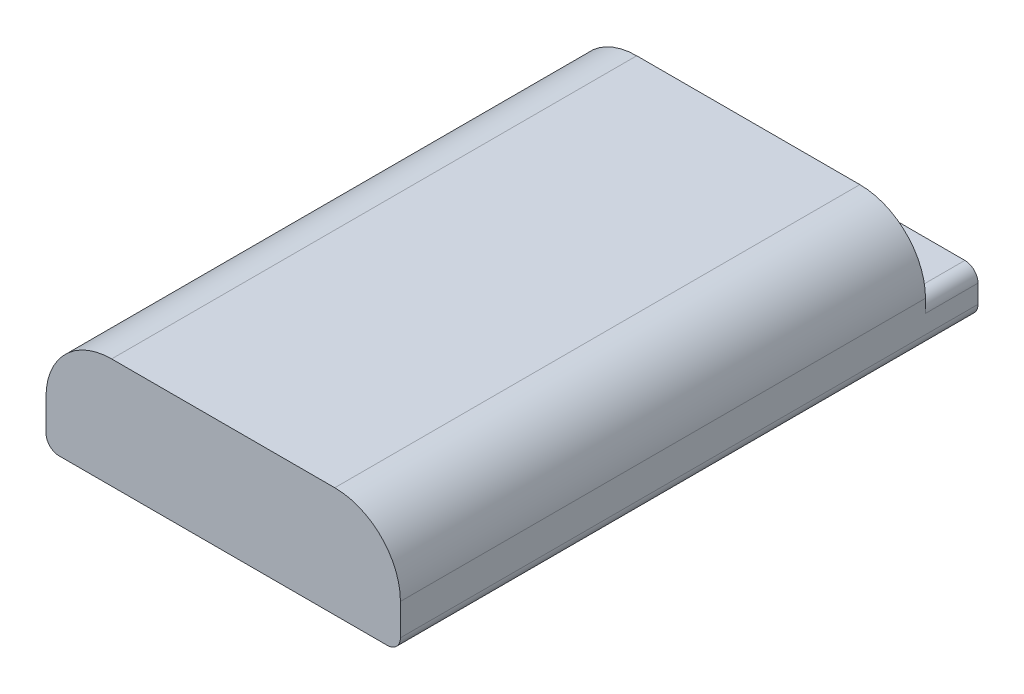
ISO-10303-21;
HEADER;
FILE_DESCRIPTION(('STEP AP214'),'2;1');
FILE_NAME('part.step','',(''),(''),'','','');
FILE_SCHEMA(('AUTOMOTIVE_DESIGN { 1 0 10303 214 1 1 1 1 }'));
ENDSEC;
DATA;
#1=APPLICATION_CONTEXT('core data for automotive mechanical design processes');
#2=APPLICATION_PROTOCOL_DEFINITION('international standard','automotive_design',2000,#1);
#3=PRODUCT_CONTEXT('',#1,'mechanical');
#4=PRODUCT('Part','Part','',(#3));
#5=PRODUCT_RELATED_PRODUCT_CATEGORY('part','',(#4));
#6=PRODUCT_DEFINITION_FORMATION('','',#4);
#7=PRODUCT_DEFINITION_CONTEXT('part definition',#1,'design');
#8=PRODUCT_DEFINITION('design','',#6,#7);
#9=PRODUCT_DEFINITION_SHAPE('','',#8);
#10=(LENGTH_UNIT() NAMED_UNIT(*) SI_UNIT(.MILLI.,.METRE.));
#11=(NAMED_UNIT(*) PLANE_ANGLE_UNIT() SI_UNIT($,.RADIAN.));
#12=(NAMED_UNIT(*) SI_UNIT($,.STERADIAN.) SOLID_ANGLE_UNIT());
#13=UNCERTAINTY_MEASURE_WITH_UNIT(LENGTH_MEASURE(1.E-05),#10,'distance_accuracy_value','');
#14=(GEOMETRIC_REPRESENTATION_CONTEXT(3) GLOBAL_UNCERTAINTY_ASSIGNED_CONTEXT((#13)) GLOBAL_UNIT_ASSIGNED_CONTEXT((#10,
#11,#12)) REPRESENTATION_CONTEXT('',''));
#15=CARTESIAN_POINT('',(0.,0.,0.));
#16=DIRECTION('',(0.,0.,1.));
#17=DIRECTION('',(1.,0.,0.));
#18=AXIS2_PLACEMENT_3D('',#15,#16,#17);
#19=CARTESIAN_POINT('',(-17.145,4.318,-27.94));
#20=DIRECTION('',(1.,0.,0.));
#21=DIRECTION('',(0.,0.,-1.));
#22=AXIS2_PLACEMENT_3D('',#19,#20,#21);
#23=PLANE('',#22);
#24=DIRECTION('',(0.,-1.,0.));
#25=VECTOR('',#24,1.);
#26=CARTESIAN_POINT('',(-17.145,4.318,27.94));
#27=LINE('',#26,#25);
#28=CARTESIAN_POINT('',(-17.145,4.31799999999996,27.94));
#29=VERTEX_POINT('',#28);
#30=CARTESIAN_POINT('',(-17.145,1.27000000000001,27.94));
#31=VERTEX_POINT('',#30);
#32=EDGE_CURVE('E165',#29,#31,#27,.T.);
#33=ORIENTED_EDGE('',*,*,#32,.F.);
#34=DIRECTION('',(0.,0.,-1.));
#35=VECTOR('',#34,1.);
#36=CARTESIAN_POINT('',(-17.145,4.31799999999996,27.94));
#37=LINE('',#36,#35);
#38=CARTESIAN_POINT('',(-17.145,4.31799999999996,-22.86));
#39=VERTEX_POINT('',#38);
#40=EDGE_CURVE('E483',#29,#39,#37,.T.);
#41=ORIENTED_EDGE('',*,*,#40,.T.);
#42=DIRECTION('',(0.,-1.,0.));
#43=VECTOR('',#42,1.);
#44=CARTESIAN_POINT('',(-17.145,10.668,-22.86));
#45=LINE('',#44,#43);
#46=CARTESIAN_POINT('',(-17.145,3.04799999999999,-22.86));
#47=VERTEX_POINT('',#46);
#48=EDGE_CURVE('E254',#39,#47,#45,.T.);
#49=ORIENTED_EDGE('',*,*,#48,.T.);
#50=DIRECTION('',(0.,0.,-1.));
#51=VECTOR('',#50,1.);
#52=CARTESIAN_POINT('',(-17.145,3.04799999999999,15.898577987311));
#53=LINE('',#52,#51);
#54=CARTESIAN_POINT('',(-17.145,3.04799999999999,-27.94));
#55=VERTEX_POINT('',#54);
#56=EDGE_CURVE('E195',#47,#55,#53,.T.);
#57=ORIENTED_EDGE('',*,*,#56,.T.);
#58=DIRECTION('',(0.,-1.,0.));
#59=VECTOR('',#58,1.);
#60=CARTESIAN_POINT('',(-17.145,4.318,-27.94));
#61=LINE('',#60,#59);
#62=CARTESIAN_POINT('',(-17.145,1.27000000000001,-27.94));
#63=VERTEX_POINT('',#62);
#64=EDGE_CURVE('E64',#55,#63,#61,.T.);
#65=ORIENTED_EDGE('',*,*,#64,.T.);
#66=DIRECTION('',(0.,0.,-1.));
#67=VECTOR('',#66,1.);
#68=CARTESIAN_POINT('',(-17.145,1.27000000000001,15.898577987311));
#69=LINE('',#68,#67);
#70=EDGE_CURVE('E157',#31,#63,#69,.T.);
#71=ORIENTED_EDGE('',*,*,#70,.F.);
#72=EDGE_LOOP('',(#33,#41,#49,#57,#65,#71));
#73=FACE_BOUND('',#72,.T.);
#74=ADVANCED_FACE('F55',(#73),#23,.F.);
#75=CARTESIAN_POINT('',(-17.145,4.318,27.94));
#76=DIRECTION('',(0.,0.,-1.));
#77=DIRECTION('',(-1.,0.,0.));
#78=AXIS2_PLACEMENT_3D('',#75,#76,#77);
#79=PLANE('',#78);
#80=CARTESIAN_POINT('',(-10.795,4.318,27.94));
#81=DIRECTION('',(0.,0.,-1.));
#82=DIRECTION('',(-1.,0.,0.));
#83=AXIS2_PLACEMENT_3D('',#80,#81,#82);
#84=CIRCLE('',#83,6.35);
#85=CARTESIAN_POINT('',(-10.795,10.668,27.94));
#86=VERTEX_POINT('',#85);
#87=EDGE_CURVE('E79',#29,#86,#84,.T.);
#88=ORIENTED_EDGE('',*,*,#87,.F.);
#89=ORIENTED_EDGE('',*,*,#32,.T.);
#90=CARTESIAN_POINT('',(-15.875,1.27,27.94));
#91=DIRECTION('',(0.,0.,-1.));
#92=DIRECTION('',(-1.,0.,0.));
#93=AXIS2_PLACEMENT_3D('',#90,#91,#92);
#94=CIRCLE('',#93,1.27);
#95=CARTESIAN_POINT('',(-15.875,0.,27.94));
#96=VERTEX_POINT('',#95);
#97=EDGE_CURVE('E148',#96,#31,#94,.T.);
#98=ORIENTED_EDGE('',*,*,#97,.F.);
#99=DIRECTION('',(1.,0.,0.));
#100=VECTOR('',#99,1.);
#101=CARTESIAN_POINT('',(-17.145,0.,27.94));
#102=LINE('',#101,#100);
#103=CARTESIAN_POINT('',(15.875,0.,27.94));
#104=VERTEX_POINT('',#103);
#105=EDGE_CURVE('E163',#96,#104,#102,.T.);
#106=ORIENTED_EDGE('',*,*,#105,.T.);
#107=CARTESIAN_POINT('',(15.875,1.27,27.94));
#108=DIRECTION('',(0.,0.,-1.));
#109=DIRECTION('',(-1.,0.,0.));
#110=AXIS2_PLACEMENT_3D('',#107,#108,#109);
#111=CIRCLE('',#110,1.27);
#112=CARTESIAN_POINT('',(17.145,1.27,27.94));
#113=VERTEX_POINT('',#112);
#114=EDGE_CURVE('E167',#113,#104,#111,.T.);
#115=ORIENTED_EDGE('',*,*,#114,.F.);
#116=DIRECTION('',(0.,-1.,0.));
#117=VECTOR('',#116,1.);
#118=CARTESIAN_POINT('',(17.145,4.318,27.94));
#119=LINE('',#118,#117);
#120=CARTESIAN_POINT('',(17.145,4.31799999999995,27.94));
#121=VERTEX_POINT('',#120);
#122=EDGE_CURVE('E180',#121,#113,#119,.T.);
#123=ORIENTED_EDGE('',*,*,#122,.F.);
#124=CARTESIAN_POINT('',(10.795,4.318,27.94));
#125=DIRECTION('',(0.,0.,-1.));
#126=DIRECTION('',(-1.,0.,0.));
#127=AXIS2_PLACEMENT_3D('',#124,#125,#126);
#128=CIRCLE('',#127,6.35);
#129=CARTESIAN_POINT('',(10.795,10.668,27.94));
#130=VERTEX_POINT('',#129);
#131=EDGE_CURVE('E497',#121,#130,#128,.F.);
#132=ORIENTED_EDGE('',*,*,#131,.T.);
#133=DIRECTION('',(1.,0.,0.));
#134=VECTOR('',#133,1.);
#135=CARTESIAN_POINT('',(-17.145,10.668,27.94));
#136=LINE('',#135,#134);
#137=EDGE_CURVE('E246',#86,#130,#136,.T.);
#138=ORIENTED_EDGE('',*,*,#137,.F.);
#139=EDGE_LOOP('',(#88,#89,#98,#106,#115,#123,#132,#138));
#140=FACE_BOUND('',#139,.T.);
#141=ADVANCED_FACE('F161',(#140),#79,.F.);
#142=CARTESIAN_POINT('',(0.,0.,0.));
#143=DIRECTION('',(0.,1.,0.));
#144=DIRECTION('',(0.,0.,1.));
#145=AXIS2_PLACEMENT_3D('',#142,#143,#144);
#146=PLANE('',#145);
#147=DIRECTION('',(0.,0.,-1.));
#148=VECTOR('',#147,1.);
#149=CARTESIAN_POINT('',(15.875,0.,15.898577987311));
#150=LINE('',#149,#148);
#151=CARTESIAN_POINT('',(15.875,0.,-27.94));
#152=VERTEX_POINT('',#151);
#153=EDGE_CURVE('E171',#104,#152,#150,.T.);
#154=ORIENTED_EDGE('',*,*,#153,.F.);
#155=ORIENTED_EDGE('',*,*,#105,.F.);
#156=DIRECTION('',(0.,0.,-1.));
#157=VECTOR('',#156,1.);
#158=CARTESIAN_POINT('',(-15.875,0.,15.898577987311));
#159=LINE('',#158,#157);
#160=CARTESIAN_POINT('',(-15.875,0.,-27.94));
#161=VERTEX_POINT('',#160);
#162=EDGE_CURVE('E145',#96,#161,#159,.T.);
#163=ORIENTED_EDGE('',*,*,#162,.T.);
#164=DIRECTION('',(-1.,0.,0.));
#165=VECTOR('',#164,1.);
#166=CARTESIAN_POINT('',(-17.145,0.,-27.94));
#167=LINE('',#166,#165);
#168=EDGE_CURVE('E175',#152,#161,#167,.T.);
#169=ORIENTED_EDGE('',*,*,#168,.F.);
#170=EDGE_LOOP('',(#154,#155,#163,#169));
#171=FACE_BOUND('',#170,.T.);
#172=ADVANCED_FACE('F170',(#171),#146,.F.);
#173=CARTESIAN_POINT('',(-17.145,10.668,-22.86));
#174=DIRECTION('',(0.,0.,1.));
#175=DIRECTION('',(1.,0.,0.));
#176=AXIS2_PLACEMENT_3D('',#173,#174,#175);
#177=PLANE('',#176);
#178=CARTESIAN_POINT('',(-10.795,4.318,-22.86));
#179=DIRECTION('',(0.,0.,-1.));
#180=DIRECTION('',(-1.,0.,0.));
#181=AXIS2_PLACEMENT_3D('',#178,#179,#180);
#182=CIRCLE('',#181,6.35);
#183=CARTESIAN_POINT('',(-10.795,10.668,-22.86));
#184=VERTEX_POINT('',#183);
#185=EDGE_CURVE('E490',#39,#184,#182,.T.);
#186=ORIENTED_EDGE('',*,*,#185,.T.);
#187=DIRECTION('',(-1.,0.,0.));
#188=VECTOR('',#187,1.);
#189=CARTESIAN_POINT('',(-17.145,10.668,-22.86));
#190=LINE('',#189,#188);
#191=CARTESIAN_POINT('',(10.795,10.668,-22.86));
#192=VERTEX_POINT('',#191);
#193=EDGE_CURVE('E250',#192,#184,#190,.T.);
#194=ORIENTED_EDGE('',*,*,#193,.F.);
#195=CARTESIAN_POINT('',(10.795,4.318,-22.86));
#196=DIRECTION('',(0.,0.,-1.));
#197=DIRECTION('',(-1.,0.,0.));
#198=AXIS2_PLACEMENT_3D('',#195,#196,#197);
#199=CIRCLE('',#198,6.35);
#200=CARTESIAN_POINT('',(17.145,4.31799999999995,-22.86));
#201=VERTEX_POINT('',#200);
#202=EDGE_CURVE('E71',#201,#192,#199,.F.);
#203=ORIENTED_EDGE('',*,*,#202,.F.);
#204=DIRECTION('',(0.,-1.,0.));
#205=VECTOR('',#204,1.);
#206=CARTESIAN_POINT('',(17.145,10.668,-22.86));
#207=LINE('',#206,#205);
#208=CARTESIAN_POINT('',(17.145,3.04799999999999,-22.86));
#209=VERTEX_POINT('',#208);
#210=EDGE_CURVE('E182',#201,#209,#207,.T.);
#211=ORIENTED_EDGE('',*,*,#210,.T.);
#212=CARTESIAN_POINT('',(15.875,3.048,-22.86));
#213=DIRECTION('',(0.,0.,1.));
#214=DIRECTION('',(1.,0.,0.));
#215=AXIS2_PLACEMENT_3D('',#212,#213,#214);
#216=CIRCLE('',#215,1.27);
#217=CARTESIAN_POINT('',(15.875,4.318,-22.86));
#218=VERTEX_POINT('',#217);
#219=EDGE_CURVE('E226',#218,#209,#216,.F.);
#220=ORIENTED_EDGE('',*,*,#219,.F.);
#221=DIRECTION('',(-1.,0.,0.));
#222=VECTOR('',#221,1.);
#223=CARTESIAN_POINT('',(-17.145,4.318,-22.86));
#224=LINE('',#223,#222);
#225=CARTESIAN_POINT('',(-15.875,4.318,-22.86));
#226=VERTEX_POINT('',#225);
#227=EDGE_CURVE('E230',#218,#226,#224,.T.);
#228=ORIENTED_EDGE('',*,*,#227,.T.);
#229=CARTESIAN_POINT('',(-15.875,3.048,-22.86));
#230=DIRECTION('',(0.,0.,1.));
#231=DIRECTION('',(1.,0.,0.));
#232=AXIS2_PLACEMENT_3D('',#229,#230,#231);
#233=CIRCLE('',#232,1.27);
#234=EDGE_CURVE('E223',#47,#226,#233,.F.);
#235=ORIENTED_EDGE('',*,*,#234,.F.);
#236=ORIENTED_EDGE('',*,*,#48,.F.);
#237=EDGE_LOOP('',(#186,#194,#203,#211,#220,#228,#235,#236));
#238=FACE_BOUND('',#237,.T.);
#239=ADVANCED_FACE('F264',(#238),#177,.F.);
#240=CARTESIAN_POINT('',(0.,10.668,0.));
#241=DIRECTION('',(0.,-1.,0.));
#242=DIRECTION('',(0.,0.,-1.));
#243=AXIS2_PLACEMENT_3D('',#240,#241,#242);
#244=PLANE('',#243);
#245=DIRECTION('',(0.,0.,-1.));
#246=VECTOR('',#245,1.);
#247=CARTESIAN_POINT('',(-10.795,10.668,27.94));
#248=LINE('',#247,#246);
#249=EDGE_CURVE('E487',#86,#184,#248,.T.);
#250=ORIENTED_EDGE('',*,*,#249,.F.);
#251=ORIENTED_EDGE('',*,*,#137,.T.);
#252=DIRECTION('',(0.,0.,-1.));
#253=VECTOR('',#252,1.);
#254=CARTESIAN_POINT('',(10.795,10.668,27.94));
#255=LINE('',#254,#253);
#256=EDGE_CURVE('E233',#130,#192,#255,.T.);
#257=ORIENTED_EDGE('',*,*,#256,.T.);
#258=ORIENTED_EDGE('',*,*,#193,.T.);
#259=EDGE_LOOP('',(#250,#251,#257,#258));
#260=FACE_BOUND('',#259,.T.);
#261=ADVANCED_FACE('F302',(#260),#244,.F.);
#262=CARTESIAN_POINT('',(-17.145,4.318,-27.94));
#263=DIRECTION('',(0.,0.,1.));
#264=DIRECTION('',(1.,0.,0.));
#265=AXIS2_PLACEMENT_3D('',#262,#263,#264);
#266=PLANE('',#265);
#267=CARTESIAN_POINT('',(-15.875,3.048,-27.94));
#268=DIRECTION('',(0.,0.,-1.));
#269=DIRECTION('',(-1.,0.,0.));
#270=AXIS2_PLACEMENT_3D('',#267,#268,#269);
#271=CIRCLE('',#270,1.27);
#272=CARTESIAN_POINT('',(-15.875,4.318,-27.94));
#273=VERTEX_POINT('',#272);
#274=EDGE_CURVE('E200',#55,#273,#271,.T.);
#275=ORIENTED_EDGE('',*,*,#274,.T.);
#276=DIRECTION('',(-1.,0.,0.));
#277=VECTOR('',#276,1.);
#278=CARTESIAN_POINT('',(-17.145,4.318,-27.94));
#279=LINE('',#278,#277);
#280=CARTESIAN_POINT('',(15.875,4.318,-27.94));
#281=VERTEX_POINT('',#280);
#282=EDGE_CURVE('E174',#281,#273,#279,.T.);
#283=ORIENTED_EDGE('',*,*,#282,.F.);
#284=CARTESIAN_POINT('',(15.875,3.048,-27.94));
#285=DIRECTION('',(0.,0.,-1.));
#286=DIRECTION('',(-1.,0.,0.));
#287=AXIS2_PLACEMENT_3D('',#284,#285,#286);
#288=CIRCLE('',#287,1.27);
#289=CARTESIAN_POINT('',(17.145,3.04799999999999,-27.94));
#290=VERTEX_POINT('',#289);
#291=EDGE_CURVE('E215',#281,#290,#288,.T.);
#292=ORIENTED_EDGE('',*,*,#291,.T.);
#293=DIRECTION('',(0.,-1.,0.));
#294=VECTOR('',#293,1.);
#295=CARTESIAN_POINT('',(17.145,4.318,-27.94));
#296=LINE('',#295,#294);
#297=CARTESIAN_POINT('',(17.145,1.27,-27.94));
#298=VERTEX_POINT('',#297);
#299=EDGE_CURVE('E13',#290,#298,#296,.T.);
#300=ORIENTED_EDGE('',*,*,#299,.T.);
#301=CARTESIAN_POINT('',(15.875,1.27,-27.94));
#302=DIRECTION('',(0.,0.,-1.));
#303=DIRECTION('',(1.,0.,0.));
#304=AXIS2_PLACEMENT_3D('',#301,#302,#303);
#305=CIRCLE('',#304,1.27);
#306=EDGE_CURVE('E211',#298,#152,#305,.T.);
#307=ORIENTED_EDGE('',*,*,#306,.T.);
#308=ORIENTED_EDGE('',*,*,#168,.T.);
#309=CARTESIAN_POINT('',(-15.875,1.27,-27.94));
#310=DIRECTION('',(0.,0.,-1.));
#311=DIRECTION('',(-1.,0.,0.));
#312=AXIS2_PLACEMENT_3D('',#309,#310,#311);
#313=CIRCLE('',#312,1.27);
#314=EDGE_CURVE('E151',#161,#63,#313,.T.);
#315=ORIENTED_EDGE('',*,*,#314,.T.);
#316=ORIENTED_EDGE('',*,*,#64,.F.);
#317=EDGE_LOOP('',(#275,#283,#292,#300,#307,#308,#315,#316));
#318=FACE_BOUND('',#317,.T.);
#319=ADVANCED_FACE('F198',(#318),#266,.F.);
#320=CARTESIAN_POINT('',(0.,4.318,0.));
#321=DIRECTION('',(0.,1.,0.));
#322=DIRECTION('',(0.,0.,1.));
#323=AXIS2_PLACEMENT_3D('',#320,#321,#322);
#324=PLANE('',#323);
#325=CARTESIAN_POINT('',(-2.54000000000001,4.318,-25.4));
#326=DIRECTION('',(0.,1.,0.));
#327=DIRECTION('',(0.,0.,1.));
#328=AXIS2_PLACEMENT_3D('',#325,#326,#327);
#329=CIRCLE('',#328,0.635);
#330=CARTESIAN_POINT('',(-2.54000000000001,4.318,-24.765));
#331=VERTEX_POINT('',#330);
#332=EDGE_CURVE('E469',#331,#331,#329,.T.);
#333=ORIENTED_EDGE('',*,*,#332,.F.);
#334=EDGE_LOOP('',(#333));
#335=FACE_BOUND('',#334,.T.);
#336=CARTESIAN_POINT('',(2.54000000000001,4.318,-25.4));
#337=DIRECTION('',(0.,1.,0.));
#338=DIRECTION('',(0.,0.,-1.));
#339=AXIS2_PLACEMENT_3D('',#336,#337,#338);
#340=CIRCLE('',#339,0.635);
#341=CARTESIAN_POINT('',(2.54000000000001,4.318,-26.035));
#342=VERTEX_POINT('',#341);
#343=EDGE_CURVE('E473',#342,#342,#340,.T.);
#344=ORIENTED_EDGE('',*,*,#343,.F.);
#345=EDGE_LOOP('',(#344));
#346=FACE_BOUND('',#345,.T.);
#347=DIRECTION('',(0.,0.,-1.));
#348=VECTOR('',#347,1.);
#349=CARTESIAN_POINT('',(-15.875,4.318,15.898577987311));
#350=LINE('',#349,#348);
#351=EDGE_CURVE('E219',#226,#273,#350,.T.);
#352=ORIENTED_EDGE('',*,*,#351,.F.);
#353=ORIENTED_EDGE('',*,*,#227,.F.);
#354=DIRECTION('',(0.,0.,-1.));
#355=VECTOR('',#354,1.);
#356=CARTESIAN_POINT('',(15.875,4.318,15.898577987311));
#357=LINE('',#356,#355);
#358=EDGE_CURVE('E220',#218,#281,#357,.T.);
#359=ORIENTED_EDGE('',*,*,#358,.T.);
#360=ORIENTED_EDGE('',*,*,#282,.T.);
#361=EDGE_LOOP('',(#352,#353,#359,#360));
#362=FACE_BOUND('',#361,.T.);
#363=ADVANCED_FACE('F276',(#335,#346,#362),#324,.T.);
#364=CARTESIAN_POINT('',(17.145,4.318,-27.94));
#365=DIRECTION('',(-1.,0.,0.));
#366=DIRECTION('',(0.,0.,1.));
#367=AXIS2_PLACEMENT_3D('',#364,#365,#366);
#368=PLANE('',#367);
#369=ORIENTED_EDGE('',*,*,#122,.T.);
#370=DIRECTION('',(0.,0.,-1.));
#371=VECTOR('',#370,1.);
#372=CARTESIAN_POINT('',(17.145,1.27,15.898577987311));
#373=LINE('',#372,#371);
#374=EDGE_CURVE('E205',#113,#298,#373,.T.);
#375=ORIENTED_EDGE('',*,*,#374,.T.);
#376=ORIENTED_EDGE('',*,*,#299,.F.);
#377=DIRECTION('',(0.,0.,-1.));
#378=VECTOR('',#377,1.);
#379=CARTESIAN_POINT('',(17.145,3.04799999999999,15.898577987311));
#380=LINE('',#379,#378);
#381=EDGE_CURVE('E214',#209,#290,#380,.T.);
#382=ORIENTED_EDGE('',*,*,#381,.F.);
#383=ORIENTED_EDGE('',*,*,#210,.F.);
#384=DIRECTION('',(0.,0.,-1.));
#385=VECTOR('',#384,1.);
#386=CARTESIAN_POINT('',(17.145,4.31799999999995,27.94));
#387=LINE('',#386,#385);
#388=EDGE_CURVE('E209',#121,#201,#387,.T.);
#389=ORIENTED_EDGE('',*,*,#388,.F.);
#390=EDGE_LOOP('',(#369,#375,#376,#382,#383,#389));
#391=FACE_BOUND('',#390,.T.);
#392=ADVANCED_FACE('F57',(#391),#368,.F.);
#393=CARTESIAN_POINT('',(15.875,1.27,15.898577987311));
#394=DIRECTION('',(0.,0.,-1.));
#395=DIRECTION('',(-1.,0.,0.));
#396=AXIS2_PLACEMENT_3D('',#393,#394,#395);
#397=CYLINDRICAL_SURFACE('',#396,1.27);
#398=ORIENTED_EDGE('',*,*,#374,.F.);
#399=ORIENTED_EDGE('',*,*,#114,.T.);
#400=ORIENTED_EDGE('',*,*,#153,.T.);
#401=ORIENTED_EDGE('',*,*,#306,.F.);
#402=EDGE_LOOP('',(#398,#399,#400,#401));
#403=FACE_BOUND('',#402,.T.);
#404=ADVANCED_FACE('F350',(#403),#397,.T.);
#405=CARTESIAN_POINT('',(-15.875,1.27,15.898577987311));
#406=DIRECTION('',(0.,0.,-1.));
#407=DIRECTION('',(-1.,0.,0.));
#408=AXIS2_PLACEMENT_3D('',#405,#406,#407);
#409=CYLINDRICAL_SURFACE('',#408,1.27);
#410=ORIENTED_EDGE('',*,*,#162,.F.);
#411=ORIENTED_EDGE('',*,*,#97,.T.);
#412=ORIENTED_EDGE('',*,*,#70,.T.);
#413=ORIENTED_EDGE('',*,*,#314,.F.);
#414=EDGE_LOOP('',(#410,#411,#412,#413));
#415=FACE_BOUND('',#414,.T.);
#416=ADVANCED_FACE('F147',(#415),#409,.T.);
#417=CARTESIAN_POINT('',(15.875,3.048,15.898577987311));
#418=DIRECTION('',(0.,0.,-1.));
#419=DIRECTION('',(-1.,0.,0.));
#420=AXIS2_PLACEMENT_3D('',#417,#418,#419);
#421=CYLINDRICAL_SURFACE('',#420,1.27);
#422=ORIENTED_EDGE('',*,*,#219,.T.);
#423=ORIENTED_EDGE('',*,*,#381,.T.);
#424=ORIENTED_EDGE('',*,*,#291,.F.);
#425=ORIENTED_EDGE('',*,*,#358,.F.);
#426=EDGE_LOOP('',(#422,#423,#424,#425));
#427=FACE_BOUND('',#426,.T.);
#428=ADVANCED_FACE('F271',(#427),#421,.T.);
#429=CARTESIAN_POINT('',(-15.875,3.048,15.898577987311));
#430=DIRECTION('',(0.,0.,-1.));
#431=DIRECTION('',(-1.,0.,0.));
#432=AXIS2_PLACEMENT_3D('',#429,#430,#431);
#433=CYLINDRICAL_SURFACE('',#432,1.27);
#434=ORIENTED_EDGE('',*,*,#234,.T.);
#435=ORIENTED_EDGE('',*,*,#351,.T.);
#436=ORIENTED_EDGE('',*,*,#274,.F.);
#437=ORIENTED_EDGE('',*,*,#56,.F.);
#438=EDGE_LOOP('',(#434,#435,#436,#437));
#439=FACE_BOUND('',#438,.T.);
#440=ADVANCED_FACE('F280',(#439),#433,.T.);
#441=CARTESIAN_POINT('',(10.795,4.318,27.94));
#442=DIRECTION('',(0.,0.,-1.));
#443=DIRECTION('',(-1.,0.,0.));
#444=AXIS2_PLACEMENT_3D('',#441,#442,#443);
#445=CYLINDRICAL_SURFACE('',#444,6.35);
#446=ORIENTED_EDGE('',*,*,#202,.T.);
#447=ORIENTED_EDGE('',*,*,#256,.F.);
#448=ORIENTED_EDGE('',*,*,#131,.F.);
#449=ORIENTED_EDGE('',*,*,#388,.T.);
#450=EDGE_LOOP('',(#446,#447,#448,#449));
#451=FACE_BOUND('',#450,.T.);
#452=ADVANCED_FACE('F282',(#451),#445,.T.);
#453=CARTESIAN_POINT('',(-10.795,4.318,27.94));
#454=DIRECTION('',(0.,0.,-1.));
#455=DIRECTION('',(-1.,0.,0.));
#456=AXIS2_PLACEMENT_3D('',#453,#454,#455);
#457=CYLINDRICAL_SURFACE('',#456,6.35);
#458=ORIENTED_EDGE('',*,*,#185,.F.);
#459=ORIENTED_EDGE('',*,*,#40,.F.);
#460=ORIENTED_EDGE('',*,*,#87,.T.);
#461=ORIENTED_EDGE('',*,*,#249,.T.);
#462=EDGE_LOOP('',(#458,#459,#460,#461));
#463=FACE_BOUND('',#462,.T.);
#464=ADVANCED_FACE('F288',(#463),#457,.T.);
#465=CARTESIAN_POINT('',(2.54000000000001,4.191,-25.4));
#466=DIRECTION('',(0.,1.,0.));
#467=DIRECTION('',(0.,0.,1.));
#468=AXIS2_PLACEMENT_3D('',#465,#466,#467);
#469=CYLINDRICAL_SURFACE('',#468,0.635);
#470=CARTESIAN_POINT('',(2.54000000000001,4.191,-25.4));
#471=DIRECTION('',(0.,1.,0.));
#472=DIRECTION('',(0.,0.,-1.));
#473=AXIS2_PLACEMENT_3D('',#470,#471,#472);
#474=CIRCLE('',#473,0.635);
#475=CARTESIAN_POINT('',(2.54000000000001,4.191,-26.035));
#476=VERTEX_POINT('',#475);
#477=EDGE_CURVE('E479',#476,#476,#474,.T.);
#478=ORIENTED_EDGE('',*,*,#477,.F.);
#479=EDGE_LOOP('',(#478));
#480=FACE_BOUND('',#479,.T.);
#481=ORIENTED_EDGE('',*,*,#343,.T.);
#482=EDGE_LOOP('',(#481));
#483=FACE_BOUND('',#482,.T.);
#484=ADVANCED_FACE('F401',(#480,#483),#469,.F.);
#485=CARTESIAN_POINT('',(2.54000000000001,4.191,-25.4));
#486=DIRECTION('',(0.,-1.,0.));
#487=DIRECTION('',(0.,0.,-1.));
#488=AXIS2_PLACEMENT_3D('',#485,#486,#487);
#489=PLANE('',#488);
#490=ORIENTED_EDGE('',*,*,#477,.T.);
#491=EDGE_LOOP('',(#490));
#492=FACE_BOUND('',#491,.T.);
#493=ADVANCED_FACE('F414',(#492),#489,.F.);
#494=CARTESIAN_POINT('',(-2.54000000000001,4.191,-25.4));
#495=DIRECTION('',(0.,1.,0.));
#496=DIRECTION('',(0.,0.,1.));
#497=AXIS2_PLACEMENT_3D('',#494,#495,#496);
#498=CYLINDRICAL_SURFACE('',#497,0.635);
#499=CARTESIAN_POINT('',(-2.54000000000001,4.191,-25.4));
#500=DIRECTION('',(0.,1.,0.));
#501=DIRECTION('',(0.,0.,1.));
#502=AXIS2_PLACEMENT_3D('',#499,#500,#501);
#503=CIRCLE('',#502,0.635);
#504=CARTESIAN_POINT('',(-2.54000000000001,4.191,-24.765));
#505=VERTEX_POINT('',#504);
#506=EDGE_CURVE('E168',#505,#505,#503,.T.);
#507=ORIENTED_EDGE('',*,*,#506,.F.);
#508=EDGE_LOOP('',(#507));
#509=FACE_BOUND('',#508,.T.);
#510=ORIENTED_EDGE('',*,*,#332,.T.);
#511=EDGE_LOOP('',(#510));
#512=FACE_BOUND('',#511,.T.);
#513=ADVANCED_FACE('F423',(#509,#512),#498,.F.);
#514=CARTESIAN_POINT('',(-2.54000000000001,4.191,-25.4));
#515=DIRECTION('',(0.,1.,0.));
#516=DIRECTION('',(0.,0.,1.));
#517=AXIS2_PLACEMENT_3D('',#514,#515,#516);
#518=PLANE('',#517);
#519=ORIENTED_EDGE('',*,*,#506,.T.);
#520=EDGE_LOOP('',(#519));
#521=FACE_BOUND('',#520,.T.);
#522=ADVANCED_FACE('F432',(#521),#518,.T.);
#523=CLOSED_SHELL('',(#74,#141,#172,#239,#261,#319,#363,#392,#404,#416,#428,#440,#452,#464,#484,
#493,#513,#522));
#524=MANIFOLD_SOLID_BREP('B2',#523);
#525=ADVANCED_BREP_SHAPE_REPRESENTATION('',(#18,#524),#14);
#526=SHAPE_DEFINITION_REPRESENTATION(#9,#525);
ENDSEC;
END-ISO-10303-21;
